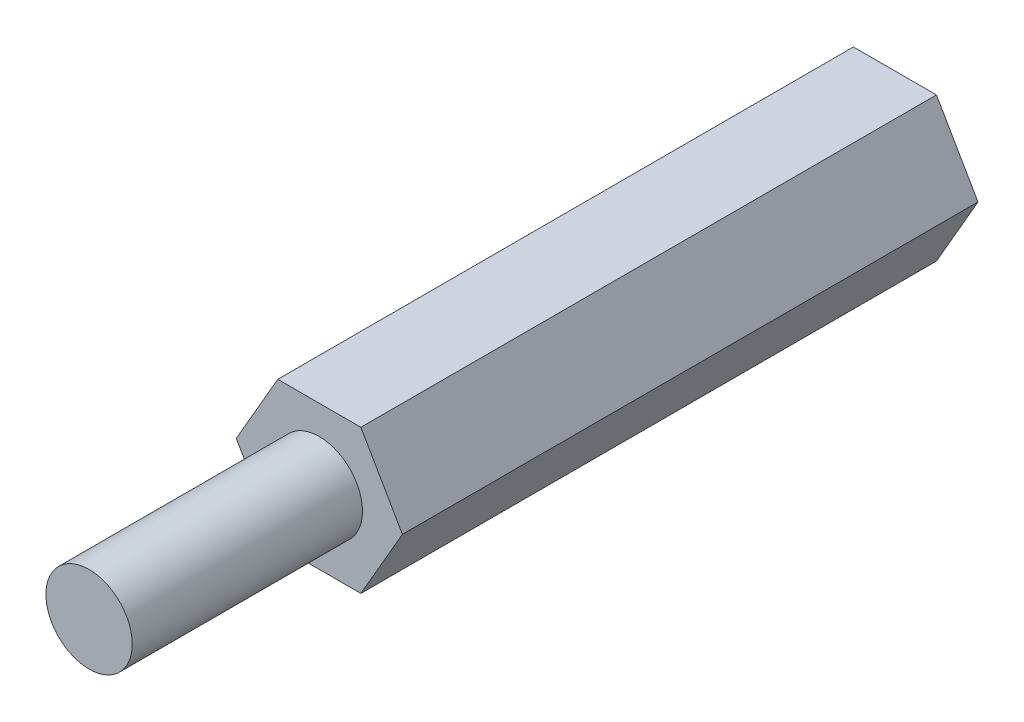
ISO-10303-21;
HEADER;
FILE_DESCRIPTION(('STEP AP214'),'2;1');
FILE_NAME('part.step','',(''),(''),'','','');
FILE_SCHEMA(('AUTOMOTIVE_DESIGN { 1 0 10303 214 1 1 1 1 }'));
ENDSEC;
DATA;
#1=APPLICATION_CONTEXT('core data for automotive mechanical design processes');
#2=APPLICATION_PROTOCOL_DEFINITION('international standard','automotive_design',2000,#1);
#3=PRODUCT_CONTEXT('',#1,'mechanical');
#4=PRODUCT('Part','Part','',(#3));
#5=PRODUCT_RELATED_PRODUCT_CATEGORY('part','',(#4));
#6=PRODUCT_DEFINITION_FORMATION('','',#4);
#7=PRODUCT_DEFINITION_CONTEXT('part definition',#1,'design');
#8=PRODUCT_DEFINITION('design','',#6,#7);
#9=PRODUCT_DEFINITION_SHAPE('','',#8);
#10=(LENGTH_UNIT() NAMED_UNIT(*) SI_UNIT(.MILLI.,.METRE.));
#11=(NAMED_UNIT(*) PLANE_ANGLE_UNIT() SI_UNIT($,.RADIAN.));
#12=(NAMED_UNIT(*) SI_UNIT($,.STERADIAN.) SOLID_ANGLE_UNIT());
#13=UNCERTAINTY_MEASURE_WITH_UNIT(LENGTH_MEASURE(1.E-05),#10,'distance_accuracy_value','');
#14=(GEOMETRIC_REPRESENTATION_CONTEXT(3) GLOBAL_UNCERTAINTY_ASSIGNED_CONTEXT((#13)) GLOBAL_UNIT_ASSIGNED_CONTEXT((#10,
#11,#12)) REPRESENTATION_CONTEXT('',''));
#15=CARTESIAN_POINT('',(0.,0.,0.));
#16=DIRECTION('',(0.,0.,1.));
#17=DIRECTION('',(1.,0.,0.));
#18=AXIS2_PLACEMENT_3D('',#15,#16,#17);
#19=CARTESIAN_POINT('',(1.44337567297407,-2.50000000000001,20.));
#20=DIRECTION('',(0.,0.,1.));
#21=DIRECTION('',(1.,0.,0.));
#22=AXIS2_PLACEMENT_3D('',#19,#20,#21);
#23=PLANE('',#22);
#24=DIRECTION('',(1.,0.,0.));
#25=VECTOR('',#24,1.);
#26=CARTESIAN_POINT('',(-1.44337567297407,-2.5,20.));
#27=LINE('',#26,#25);
#28=CARTESIAN_POINT('',(-1.44337567297407,-2.5,20.));
#29=VERTEX_POINT('',#28);
#30=CARTESIAN_POINT('',(1.44337567297406,-2.50000000000001,20.));
#31=VERTEX_POINT('',#30);
#32=EDGE_CURVE('E137',#29,#31,#27,.T.);
#33=ORIENTED_EDGE('',*,*,#32,.T.);
#34=DIRECTION('',(0.499999999999999,0.866025403784439,0.));
#35=VECTOR('',#34,1.);
#36=CARTESIAN_POINT('',(1.44337567297406,-2.50000000000001,20.));
#37=LINE('',#36,#35);
#38=CARTESIAN_POINT('',(2.88675134594814,0.,20.));
#39=VERTEX_POINT('',#38);
#40=EDGE_CURVE('E94',#31,#39,#37,.T.);
#41=ORIENTED_EDGE('',*,*,#40,.T.);
#42=DIRECTION('',(-0.5,0.866025403784439,0.));
#43=VECTOR('',#42,1.);
#44=CARTESIAN_POINT('',(2.88675134594814,0.,20.));
#45=LINE('',#44,#43);
#46=CARTESIAN_POINT('',(1.44337567297407,2.50000000000002,20.));
#47=VERTEX_POINT('',#46);
#48=EDGE_CURVE('E108',#39,#47,#45,.T.);
#49=ORIENTED_EDGE('',*,*,#48,.T.);
#50=DIRECTION('',(-1.,0.,0.));
#51=VECTOR('',#50,1.);
#52=CARTESIAN_POINT('',(1.44337567297407,2.50000000000002,20.));
#53=LINE('',#52,#51);
#54=CARTESIAN_POINT('',(-1.44337567297407,2.50000000000002,20.));
#55=VERTEX_POINT('',#54);
#56=EDGE_CURVE('E102',#47,#55,#53,.T.);
#57=ORIENTED_EDGE('',*,*,#56,.T.);
#58=DIRECTION('',(-0.500000000000001,-0.866025403784438,0.));
#59=VECTOR('',#58,1.);
#60=CARTESIAN_POINT('',(-1.44337567297407,2.50000000000002,20.));
#61=LINE('',#60,#59);
#62=CARTESIAN_POINT('',(-2.88675134594814,0.,20.));
#63=VERTEX_POINT('',#62);
#64=EDGE_CURVE('E106',#55,#63,#61,.T.);
#65=ORIENTED_EDGE('',*,*,#64,.T.);
#66=DIRECTION('',(0.5,-0.866025403784439,0.));
#67=VECTOR('',#66,1.);
#68=CARTESIAN_POINT('',(-2.88675134594814,0.,20.));
#69=LINE('',#68,#67);
#70=EDGE_CURVE('E56',#63,#29,#69,.T.);
#71=ORIENTED_EDGE('',*,*,#70,.T.);
#72=EDGE_LOOP('',(#33,#41,#49,#57,#65,#71));
#73=FACE_BOUND('',#72,.T.);
#74=CARTESIAN_POINT('',(0.,0.,20.));
#75=DIRECTION('',(0.,0.,1.));
#76=DIRECTION('',(1.,0.,0.));
#77=AXIS2_PLACEMENT_3D('',#74,#75,#76);
#78=CIRCLE('',#77,1.5);
#79=CARTESIAN_POINT('',(1.5,0.,20.));
#80=VERTEX_POINT('',#79);
#81=EDGE_CURVE('E192',#80,#80,#78,.T.);
#82=ORIENTED_EDGE('',*,*,#81,.F.);
#83=EDGE_LOOP('',(#82));
#84=FACE_BOUND('',#83,.T.);
#85=ADVANCED_FACE('F39',(#73,#84),#23,.T.);
#86=CARTESIAN_POINT('',(-1.44337567297407,-2.5,20.));
#87=DIRECTION('',(0.,1.,0.));
#88=DIRECTION('',(-1.,0.,0.));
#89=AXIS2_PLACEMENT_3D('',#86,#87,#88);
#90=PLANE('',#89);
#91=DIRECTION('',(1.,0.,0.));
#92=VECTOR('',#91,1.);
#93=CARTESIAN_POINT('',(-1.44337567297407,-2.5,0.));
#94=LINE('',#93,#92);
#95=CARTESIAN_POINT('',(-1.44337567297407,-2.5,0.));
#96=VERTEX_POINT('',#95);
#97=CARTESIAN_POINT('',(1.44337567297406,-2.50000000000001,0.));
#98=VERTEX_POINT('',#97);
#99=EDGE_CURVE('E126',#96,#98,#94,.T.);
#100=ORIENTED_EDGE('',*,*,#99,.T.);
#101=DIRECTION('',(0.,0.,-1.));
#102=VECTOR('',#101,1.);
#103=CARTESIAN_POINT('',(1.44337567297406,-2.50000000000001,20.));
#104=LINE('',#103,#102);
#105=EDGE_CURVE('E11',#31,#98,#104,.T.);
#106=ORIENTED_EDGE('',*,*,#105,.F.);
#107=ORIENTED_EDGE('',*,*,#32,.F.);
#108=DIRECTION('',(0.,0.,-1.));
#109=VECTOR('',#108,1.);
#110=CARTESIAN_POINT('',(-1.44337567297407,-2.5,20.));
#111=LINE('',#110,#109);
#112=EDGE_CURVE('E122',#29,#96,#111,.T.);
#113=ORIENTED_EDGE('',*,*,#112,.T.);
#114=EDGE_LOOP('',(#100,#106,#107,#113));
#115=FACE_BOUND('',#114,.T.);
#116=ADVANCED_FACE('F41',(#115),#90,.F.);
#117=CARTESIAN_POINT('',(1.44337567297406,-2.50000000000001,20.));
#118=DIRECTION('',(-0.866025403784439,0.499999999999999,0.));
#119=DIRECTION('',(-0.499999999999999,-0.866025403784439,0.));
#120=AXIS2_PLACEMENT_3D('',#117,#118,#119);
#121=PLANE('',#120);
#122=DIRECTION('',(0.499999999999999,0.866025403784439,0.));
#123=VECTOR('',#122,1.);
#124=CARTESIAN_POINT('',(1.44337567297406,-2.50000000000001,0.));
#125=LINE('',#124,#123);
#126=CARTESIAN_POINT('',(2.88675134594814,0.,0.));
#127=VERTEX_POINT('',#126);
#128=EDGE_CURVE('E129',#98,#127,#125,.T.);
#129=ORIENTED_EDGE('',*,*,#128,.T.);
#130=DIRECTION('',(0.,0.,-1.));
#131=VECTOR('',#130,1.);
#132=CARTESIAN_POINT('',(2.88675134594814,0.,20.));
#133=LINE('',#132,#131);
#134=EDGE_CURVE('E48',#39,#127,#133,.T.);
#135=ORIENTED_EDGE('',*,*,#134,.F.);
#136=ORIENTED_EDGE('',*,*,#40,.F.);
#137=ORIENTED_EDGE('',*,*,#105,.T.);
#138=EDGE_LOOP('',(#129,#135,#136,#137));
#139=FACE_BOUND('',#138,.T.);
#140=ADVANCED_FACE('F166',(#139),#121,.F.);
#141=CARTESIAN_POINT('',(2.88675134594814,0.,20.));
#142=DIRECTION('',(-0.866025403784439,-0.5,0.));
#143=DIRECTION('',(0.5,-0.866025403784439,0.));
#144=AXIS2_PLACEMENT_3D('',#141,#142,#143);
#145=PLANE('',#144);
#146=DIRECTION('',(-0.5,0.866025403784439,0.));
#147=VECTOR('',#146,1.);
#148=CARTESIAN_POINT('',(2.88675134594814,0.,0.));
#149=LINE('',#148,#147);
#150=CARTESIAN_POINT('',(1.44337567297407,2.50000000000002,0.));
#151=VERTEX_POINT('',#150);
#152=EDGE_CURVE('E132',#127,#151,#149,.T.);
#153=ORIENTED_EDGE('',*,*,#152,.T.);
#154=DIRECTION('',(0.,0.,-1.));
#155=VECTOR('',#154,1.);
#156=CARTESIAN_POINT('',(1.44337567297407,2.50000000000002,20.));
#157=LINE('',#156,#155);
#158=EDGE_CURVE('E117',#47,#151,#157,.T.);
#159=ORIENTED_EDGE('',*,*,#158,.F.);
#160=ORIENTED_EDGE('',*,*,#48,.F.);
#161=ORIENTED_EDGE('',*,*,#134,.T.);
#162=EDGE_LOOP('',(#153,#159,#160,#161));
#163=FACE_BOUND('',#162,.T.);
#164=ADVANCED_FACE('F143',(#163),#145,.F.);
#165=CARTESIAN_POINT('',(1.44337567297407,2.50000000000002,20.));
#166=DIRECTION('',(0.,-1.,0.));
#167=DIRECTION('',(1.,0.,0.));
#168=AXIS2_PLACEMENT_3D('',#165,#166,#167);
#169=PLANE('',#168);
#170=DIRECTION('',(-1.,0.,0.));
#171=VECTOR('',#170,1.);
#172=CARTESIAN_POINT('',(1.44337567297407,2.50000000000002,0.));
#173=LINE('',#172,#171);
#174=CARTESIAN_POINT('',(-1.44337567297407,2.50000000000002,0.));
#175=VERTEX_POINT('',#174);
#176=EDGE_CURVE('E116',#151,#175,#173,.T.);
#177=ORIENTED_EDGE('',*,*,#176,.T.);
#178=DIRECTION('',(0.,0.,-1.));
#179=VECTOR('',#178,1.);
#180=CARTESIAN_POINT('',(-1.44337567297407,2.50000000000002,20.));
#181=LINE('',#180,#179);
#182=EDGE_CURVE('E113',#55,#175,#181,.T.);
#183=ORIENTED_EDGE('',*,*,#182,.F.);
#184=ORIENTED_EDGE('',*,*,#56,.F.);
#185=ORIENTED_EDGE('',*,*,#158,.T.);
#186=EDGE_LOOP('',(#177,#183,#184,#185));
#187=FACE_BOUND('',#186,.T.);
#188=ADVANCED_FACE('F114',(#187),#169,.F.);
#189=CARTESIAN_POINT('',(-1.44337567297407,2.50000000000002,20.));
#190=DIRECTION('',(0.866025403784438,-0.500000000000001,0.));
#191=DIRECTION('',(0.500000000000001,0.866025403784438,0.));
#192=AXIS2_PLACEMENT_3D('',#189,#190,#191);
#193=PLANE('',#192);
#194=DIRECTION('',(-0.500000000000001,-0.866025403784438,0.));
#195=VECTOR('',#194,1.);
#196=CARTESIAN_POINT('',(-1.44337567297407,2.50000000000002,0.));
#197=LINE('',#196,#195);
#198=CARTESIAN_POINT('',(-2.88675134594814,0.,0.));
#199=VERTEX_POINT('',#198);
#200=EDGE_CURVE('E80',#175,#199,#197,.T.);
#201=ORIENTED_EDGE('',*,*,#200,.T.);
#202=DIRECTION('',(0.,0.,-1.));
#203=VECTOR('',#202,1.);
#204=CARTESIAN_POINT('',(-2.88675134594814,0.,20.));
#205=LINE('',#204,#203);
#206=EDGE_CURVE('E118',#63,#199,#205,.T.);
#207=ORIENTED_EDGE('',*,*,#206,.F.);
#208=ORIENTED_EDGE('',*,*,#64,.F.);
#209=ORIENTED_EDGE('',*,*,#182,.T.);
#210=EDGE_LOOP('',(#201,#207,#208,#209));
#211=FACE_BOUND('',#210,.T.);
#212=ADVANCED_FACE('F120',(#211),#193,.F.);
#213=CARTESIAN_POINT('',(-2.88675134594814,0.,20.));
#214=DIRECTION('',(0.866025403784439,0.5,0.));
#215=DIRECTION('',(-0.5,0.866025403784439,0.));
#216=AXIS2_PLACEMENT_3D('',#213,#214,#215);
#217=PLANE('',#216);
#218=DIRECTION('',(0.5,-0.866025403784439,0.));
#219=VECTOR('',#218,1.);
#220=CARTESIAN_POINT('',(-2.88675134594814,0.,0.));
#221=LINE('',#220,#219);
#222=EDGE_CURVE('E86',#199,#96,#221,.T.);
#223=ORIENTED_EDGE('',*,*,#222,.T.);
#224=ORIENTED_EDGE('',*,*,#112,.F.);
#225=ORIENTED_EDGE('',*,*,#70,.F.);
#226=ORIENTED_EDGE('',*,*,#206,.T.);
#227=EDGE_LOOP('',(#223,#224,#225,#226));
#228=FACE_BOUND('',#227,.T.);
#229=ADVANCED_FACE('F150',(#228),#217,.F.);
#230=CARTESIAN_POINT('',(1.44337567297407,-2.50000000000001,0.));
#231=DIRECTION('',(0.,0.,1.));
#232=DIRECTION('',(1.,0.,0.));
#233=AXIS2_PLACEMENT_3D('',#230,#231,#232);
#234=PLANE('',#233);
#235=CARTESIAN_POINT('',(0.,0.,0.));
#236=DIRECTION('',(0.,0.,-1.));
#237=DIRECTION('',(-1.,0.,0.));
#238=AXIS2_PLACEMENT_3D('',#235,#236,#237);
#239=CIRCLE('',#238,1.24999999999999);
#240=CARTESIAN_POINT('',(-1.24999999999999,0.,0.));
#241=VERTEX_POINT('',#240);
#242=EDGE_CURVE('E189',#241,#241,#239,.T.);
#243=ORIENTED_EDGE('',*,*,#242,.F.);
#244=EDGE_LOOP('',(#243));
#245=FACE_BOUND('',#244,.T.);
#246=ORIENTED_EDGE('',*,*,#99,.F.);
#247=ORIENTED_EDGE('',*,*,#222,.F.);
#248=ORIENTED_EDGE('',*,*,#200,.F.);
#249=ORIENTED_EDGE('',*,*,#176,.F.);
#250=ORIENTED_EDGE('',*,*,#152,.F.);
#251=ORIENTED_EDGE('',*,*,#128,.F.);
#252=EDGE_LOOP('',(#246,#247,#248,#249,#250,#251));
#253=FACE_BOUND('',#252,.T.);
#254=ADVANCED_FACE('F146',(#245,#253),#234,.F.);
#255=CARTESIAN_POINT('',(0.,0.,28.));
#256=DIRECTION('',(0.,0.,-1.));
#257=DIRECTION('',(-1.,0.,0.));
#258=AXIS2_PLACEMENT_3D('',#255,#256,#257);
#259=CYLINDRICAL_SURFACE('',#258,1.5);
#260=CARTESIAN_POINT('',(0.,0.,28.));
#261=DIRECTION('',(0.,0.,1.));
#262=DIRECTION('',(1.,0.,0.));
#263=AXIS2_PLACEMENT_3D('',#260,#261,#262);
#264=CIRCLE('',#263,1.5);
#265=CARTESIAN_POINT('',(1.5,0.,28.));
#266=VERTEX_POINT('',#265);
#267=EDGE_CURVE('E130',#266,#266,#264,.T.);
#268=ORIENTED_EDGE('',*,*,#267,.F.);
#269=EDGE_LOOP('',(#268));
#270=FACE_BOUND('',#269,.T.);
#271=ORIENTED_EDGE('',*,*,#81,.T.);
#272=EDGE_LOOP('',(#271));
#273=FACE_BOUND('',#272,.T.);
#274=ADVANCED_FACE('F157',(#270,#273),#259,.T.);
#275=CARTESIAN_POINT('',(0.,0.,28.));
#276=DIRECTION('',(0.,0.,1.));
#277=DIRECTION('',(1.,0.,0.));
#278=AXIS2_PLACEMENT_3D('',#275,#276,#277);
#279=PLANE('',#278);
#280=ORIENTED_EDGE('',*,*,#267,.T.);
#281=EDGE_LOOP('',(#280));
#282=FACE_BOUND('',#281,.T.);
#283=ADVANCED_FACE('F170',(#282),#279,.T.);
#284=CARTESIAN_POINT('',(0.,0.,0.));
#285=DIRECTION('',(0.,0.,-1.));
#286=DIRECTION('',(-1.,0.,0.));
#287=AXIS2_PLACEMENT_3D('',#284,#285,#286);
#288=CYLINDRICAL_SURFACE('',#287,1.24999999999999);
#289=CARTESIAN_POINT('',(0.,0.,11.));
#290=DIRECTION('',(0.,0.,-1.));
#291=DIRECTION('',(-1.,0.,0.));
#292=AXIS2_PLACEMENT_3D('',#289,#290,#291);
#293=CIRCLE('',#292,1.25);
#294=CARTESIAN_POINT('',(-1.25,0.,11.));
#295=VERTEX_POINT('',#294);
#296=EDGE_CURVE('E188',#295,#295,#293,.T.);
#297=ORIENTED_EDGE('',*,*,#296,.F.);
#298=EDGE_LOOP('',(#297));
#299=FACE_BOUND('',#298,.T.);
#300=ORIENTED_EDGE('',*,*,#242,.T.);
#301=EDGE_LOOP('',(#300));
#302=FACE_BOUND('',#301,.T.);
#303=ADVANCED_FACE('F174',(#299,#302),#288,.F.);
#304=CARTESIAN_POINT('',(0.,0.,11.));
#305=DIRECTION('',(0.,0.,-1.));
#306=DIRECTION('',(-1.,0.,0.));
#307=AXIS2_PLACEMENT_3D('',#304,#305,#306);
#308=CONICAL_SURFACE('',#307,1.25,1.02974425867665);
#309=CARTESIAN_POINT('',(0.,0.,11.7510757737845));
#310=VERTEX_POINT('',#309);
#311=VERTEX_LOOP('',#310);
#312=FACE_BOUND('',#311,.T.);
#313=ORIENTED_EDGE('',*,*,#296,.T.);
#314=EDGE_LOOP('',(#313));
#315=FACE_BOUND('',#314,.T.);
#316=ADVANCED_FACE('F178',(#312,#315),#308,.F.);
#317=CLOSED_SHELL('',(#85,#116,#140,#164,#188,#212,#229,#254,#274,#283,#303,#316));
#318=MANIFOLD_SOLID_BREP('B2',#317);
#319=ADVANCED_BREP_SHAPE_REPRESENTATION('',(#18,#318),#14);
#320=SHAPE_DEFINITION_REPRESENTATION(#9,#319);
ENDSEC;
END-ISO-10303-21;
